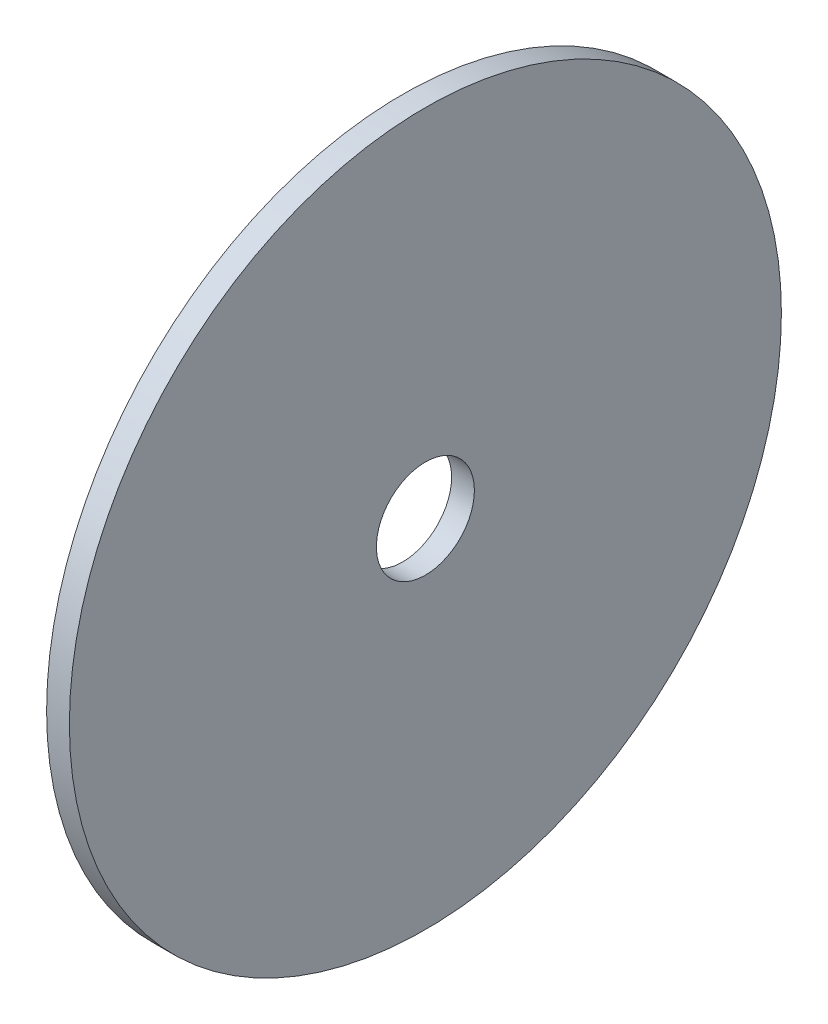
ISO-10303-21;
HEADER;
FILE_DESCRIPTION(('STEP AP214'),'2;1');
FILE_NAME('part.step','',(''),(''),'','','');
FILE_SCHEMA(('AUTOMOTIVE_DESIGN { 1 0 10303 214 1 1 1 1 }'));
ENDSEC;
DATA;
#1=APPLICATION_CONTEXT('core data for automotive mechanical design processes');
#2=APPLICATION_PROTOCOL_DEFINITION('international standard','automotive_design',2000,#1);
#3=PRODUCT_CONTEXT('',#1,'mechanical');
#4=PRODUCT('Part','Part','',(#3));
#5=PRODUCT_RELATED_PRODUCT_CATEGORY('part','',(#4));
#6=PRODUCT_DEFINITION_FORMATION('','',#4);
#7=PRODUCT_DEFINITION_CONTEXT('part definition',#1,'design');
#8=PRODUCT_DEFINITION('design','',#6,#7);
#9=PRODUCT_DEFINITION_SHAPE('','',#8);
#10=(LENGTH_UNIT() NAMED_UNIT(*) SI_UNIT(.MILLI.,.METRE.));
#11=(NAMED_UNIT(*) PLANE_ANGLE_UNIT() SI_UNIT($,.RADIAN.));
#12=(NAMED_UNIT(*) SI_UNIT($,.STERADIAN.) SOLID_ANGLE_UNIT());
#13=UNCERTAINTY_MEASURE_WITH_UNIT(LENGTH_MEASURE(1.E-05),#10,'distance_accuracy_value','');
#14=(GEOMETRIC_REPRESENTATION_CONTEXT(3) GLOBAL_UNCERTAINTY_ASSIGNED_CONTEXT((#13)) GLOBAL_UNIT_ASSIGNED_CONTEXT((#10,
#11,#12)) REPRESENTATION_CONTEXT('',''));
#15=CARTESIAN_POINT('',(0.,0.,0.));
#16=DIRECTION('',(0.,0.,1.));
#17=DIRECTION('',(1.,0.,0.));
#18=AXIS2_PLACEMENT_3D('',#15,#16,#17);
#19=CARTESIAN_POINT('',(2.032,0.,0.));
#20=DIRECTION('',(1.,0.,0.));
#21=DIRECTION('',(0.,0.,-1.));
#22=AXIS2_PLACEMENT_3D('',#19,#20,#21);
#23=PLANE('',#22);
#24=CARTESIAN_POINT('',(2.032,0.,0.));
#25=DIRECTION('',(1.,0.,0.));
#26=DIRECTION('',(0.,0.,-1.));
#27=AXIS2_PLACEMENT_3D('',#24,#25,#26);
#28=CIRCLE('',#27,31.75);
#29=CARTESIAN_POINT('',(2.032,0.,-31.75));
#30=VERTEX_POINT('',#29);
#31=EDGE_CURVE('E10',#30,#30,#28,.T.);
#32=ORIENTED_EDGE('',*,*,#31,.T.);
#33=EDGE_LOOP('',(#32));
#34=FACE_BOUND('',#33,.T.);
#35=CARTESIAN_POINT('',(2.032,0.,0.));
#36=DIRECTION('',(1.,0.,0.));
#37=DIRECTION('',(0.,0.,-1.));
#38=AXIS2_PLACEMENT_3D('',#35,#36,#37);
#39=CIRCLE('',#38,4.3688);
#40=CARTESIAN_POINT('',(2.032,0.,-4.3688));
#41=VERTEX_POINT('',#40);
#42=EDGE_CURVE('E43',#41,#41,#39,.T.);
#43=ORIENTED_EDGE('',*,*,#42,.F.);
#44=EDGE_LOOP('',(#43));
#45=FACE_BOUND('',#44,.T.);
#46=ADVANCED_FACE('F32',(#34,#45),#23,.T.);
#47=CARTESIAN_POINT('',(0.,0.,0.));
#48=DIRECTION('',(1.,0.,0.));
#49=DIRECTION('',(0.,0.,-1.));
#50=AXIS2_PLACEMENT_3D('',#47,#48,#49);
#51=PLANE('',#50);
#52=CARTESIAN_POINT('',(0.,0.,0.));
#53=DIRECTION('',(1.,0.,0.));
#54=DIRECTION('',(0.,0.,-1.));
#55=AXIS2_PLACEMENT_3D('',#52,#53,#54);
#56=CIRCLE('',#55,31.75);
#57=CARTESIAN_POINT('',(0.,0.,-31.75));
#58=VERTEX_POINT('',#57);
#59=EDGE_CURVE('E36',#58,#58,#56,.T.);
#60=ORIENTED_EDGE('',*,*,#59,.F.);
#61=EDGE_LOOP('',(#60));
#62=FACE_BOUND('',#61,.T.);
#63=CARTESIAN_POINT('',(0.,0.,0.));
#64=DIRECTION('',(1.,0.,0.));
#65=DIRECTION('',(0.,0.,-1.));
#66=AXIS2_PLACEMENT_3D('',#63,#64,#65);
#67=CIRCLE('',#66,4.3688);
#68=CARTESIAN_POINT('',(0.,0.,-4.3688));
#69=VERTEX_POINT('',#68);
#70=EDGE_CURVE('E45',#69,#69,#67,.T.);
#71=ORIENTED_EDGE('',*,*,#70,.T.);
#72=EDGE_LOOP('',(#71));
#73=FACE_BOUND('',#72,.T.);
#74=ADVANCED_FACE('F55',(#62,#73),#51,.F.);
#75=CARTESIAN_POINT('',(2.032,0.,0.));
#76=DIRECTION('',(-1.,0.,0.));
#77=DIRECTION('',(0.,0.,1.));
#78=AXIS2_PLACEMENT_3D('',#75,#76,#77);
#79=CYLINDRICAL_SURFACE('',#78,31.75);
#80=ORIENTED_EDGE('',*,*,#31,.F.);
#81=EDGE_LOOP('',(#80));
#82=FACE_BOUND('',#81,.T.);
#83=ORIENTED_EDGE('',*,*,#59,.T.);
#84=EDGE_LOOP('',(#83));
#85=FACE_BOUND('',#84,.T.);
#86=ADVANCED_FACE('F34',(#82,#85),#79,.T.);
#87=CARTESIAN_POINT('',(2.032,0.,0.));
#88=DIRECTION('',(-1.,0.,0.));
#89=DIRECTION('',(0.,0.,1.));
#90=AXIS2_PLACEMENT_3D('',#87,#88,#89);
#91=CYLINDRICAL_SURFACE('',#90,4.3688);
#92=ORIENTED_EDGE('',*,*,#42,.T.);
#93=EDGE_LOOP('',(#92));
#94=FACE_BOUND('',#93,.T.);
#95=ORIENTED_EDGE('',*,*,#70,.F.);
#96=EDGE_LOOP('',(#95));
#97=FACE_BOUND('',#96,.T.);
#98=ADVANCED_FACE('F51',(#94,#97),#91,.F.);
#99=CLOSED_SHELL('',(#46,#74,#86,#98));
#100=MANIFOLD_SOLID_BREP('B2',#99);
#101=ADVANCED_BREP_SHAPE_REPRESENTATION('',(#18,#100),#14);
#102=SHAPE_DEFINITION_REPRESENTATION(#9,#101);
ENDSEC;
END-ISO-10303-21;
